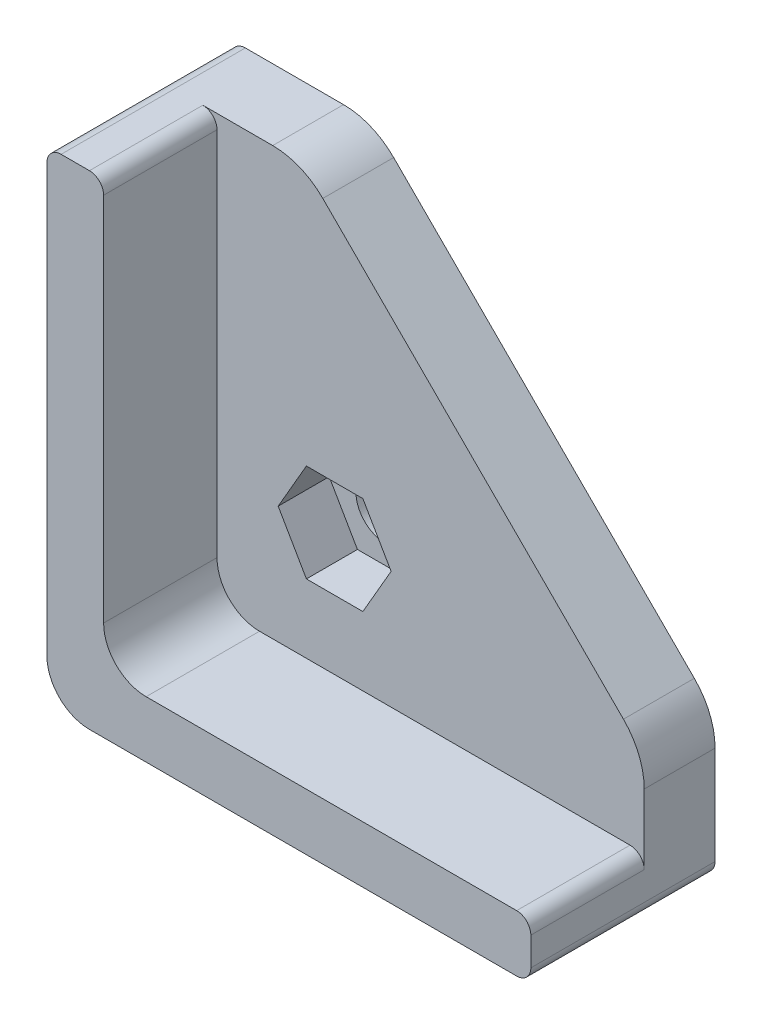
ISO-10303-21;
HEADER;
FILE_DESCRIPTION(('STEP AP214'),'2;1');
FILE_NAME('part.step','',(''),(''),'','','');
FILE_SCHEMA(('AUTOMOTIVE_DESIGN { 1 0 10303 214 1 1 1 1 }'));
ENDSEC;
DATA;
#1=APPLICATION_CONTEXT('core data for automotive mechanical design processes');
#2=APPLICATION_PROTOCOL_DEFINITION('international standard','automotive_design',2000,#1);
#3=PRODUCT_CONTEXT('',#1,'mechanical');
#4=PRODUCT('Part','Part','',(#3));
#5=PRODUCT_RELATED_PRODUCT_CATEGORY('part','',(#4));
#6=PRODUCT_DEFINITION_FORMATION('','',#4);
#7=PRODUCT_DEFINITION_CONTEXT('part definition',#1,'design');
#8=PRODUCT_DEFINITION('design','',#6,#7);
#9=PRODUCT_DEFINITION_SHAPE('','',#8);
#10=(LENGTH_UNIT() NAMED_UNIT(*) SI_UNIT(.MILLI.,.METRE.));
#11=(NAMED_UNIT(*) PLANE_ANGLE_UNIT() SI_UNIT($,.RADIAN.));
#12=(NAMED_UNIT(*) SI_UNIT($,.STERADIAN.) SOLID_ANGLE_UNIT());
#13=UNCERTAINTY_MEASURE_WITH_UNIT(LENGTH_MEASURE(1.E-05),#10,'distance_accuracy_value','');
#14=(GEOMETRIC_REPRESENTATION_CONTEXT(3) GLOBAL_UNCERTAINTY_ASSIGNED_CONTEXT((#13)) GLOBAL_UNIT_ASSIGNED_CONTEXT((#10,
#11,#12)) REPRESENTATION_CONTEXT('',''));
#15=CARTESIAN_POINT('',(0.,0.,0.));
#16=DIRECTION('',(0.,0.,1.));
#17=DIRECTION('',(1.,0.,0.));
#18=AXIS2_PLACEMENT_3D('',#15,#16,#17);
#19=CARTESIAN_POINT('',(235.585920771116,2.62277996633536,5.));
#20=DIRECTION('',(0.,0.,-1.));
#21=DIRECTION('',(-1.,0.,0.));
#22=AXIS2_PLACEMENT_3D('',#19,#20,#21);
#23=CYLINDRICAL_SURFACE('',#22,2.09999999999999);
#24=CARTESIAN_POINT('',(235.585920771116,2.62277996633536,0.));
#25=DIRECTION('',(0.,0.,1.));
#26=DIRECTION('',(1.,0.,0.));
#27=AXIS2_PLACEMENT_3D('',#24,#25,#26);
#28=CIRCLE('',#27,2.09999999999999);
#29=CARTESIAN_POINT('',(237.685920771116,2.62277996633536,0.));
#30=VERTEX_POINT('',#29);
#31=EDGE_CURVE('E259',#30,#30,#28,.T.);
#32=ORIENTED_EDGE('',*,*,#31,.F.);
#33=EDGE_LOOP('',(#32));
#34=FACE_BOUND('',#33,.T.);
#35=CARTESIAN_POINT('',(235.585920771116,2.62277996633536,1.4));
#36=DIRECTION('',(0.,0.,1.));
#37=DIRECTION('',(1.,0.,0.));
#38=AXIS2_PLACEMENT_3D('',#35,#36,#37);
#39=CIRCLE('',#38,2.09999999999999);
#40=CARTESIAN_POINT('',(237.685920771116,2.62277996633536,1.4));
#41=VERTEX_POINT('',#40);
#42=EDGE_CURVE('E234',#41,#41,#39,.T.);
#43=ORIENTED_EDGE('',*,*,#42,.T.);
#44=EDGE_LOOP('',(#43));
#45=FACE_BOUND('',#44,.T.);
#46=ADVANCED_FACE('F37',(#34,#45),#23,.F.);
#47=CARTESIAN_POINT('',(0.,0.,5.));
#48=DIRECTION('',(0.,0.,-1.));
#49=DIRECTION('',(-1.,0.,0.));
#50=AXIS2_PLACEMENT_3D('',#47,#48,#49);
#51=PLANE('',#50);
#52=DIRECTION('',(-0.500000000000004,0.866025403784436,0.));
#53=VECTOR('',#52,1.);
#54=CARTESIAN_POINT('',(239.569637628525,2.62277996633537,5.));
#55=LINE('',#54,#53);
#56=CARTESIAN_POINT('',(239.569637628525,2.62277996633536,5.));
#57=VERTEX_POINT('',#56);
#58=CARTESIAN_POINT('',(237.57777919982,6.07277996633536,5.));
#59=VERTEX_POINT('',#58);
#60=EDGE_CURVE('E222',#57,#59,#55,.T.);
#61=ORIENTED_EDGE('',*,*,#60,.F.);
#62=DIRECTION('',(0.499999999999997,0.866025403784441,0.));
#63=VECTOR('',#62,1.);
#64=CARTESIAN_POINT('',(237.57777919982,-0.827220033664637,5.));
#65=LINE('',#64,#63);
#66=CARTESIAN_POINT('',(237.57777919982,-0.827220033664637,5.));
#67=VERTEX_POINT('',#66);
#68=EDGE_CURVE('E190',#67,#57,#65,.T.);
#69=ORIENTED_EDGE('',*,*,#68,.F.);
#70=DIRECTION('',(1.,0.,0.));
#71=VECTOR('',#70,1.);
#72=CARTESIAN_POINT('',(233.594062342412,-0.827220033664661,5.));
#73=LINE('',#72,#71);
#74=CARTESIAN_POINT('',(233.594062342412,-0.827220033664661,5.));
#75=VERTEX_POINT('',#74);
#76=EDGE_CURVE('E208',#75,#67,#73,.T.);
#77=ORIENTED_EDGE('',*,*,#76,.F.);
#78=DIRECTION('',(0.500000000000005,-0.866025403784436,0.));
#79=VECTOR('',#78,1.);
#80=CARTESIAN_POINT('',(231.602203913708,2.62277996633537,5.));
#81=LINE('',#80,#79);
#82=CARTESIAN_POINT('',(231.602203913708,2.62277996633537,5.));
#83=VERTEX_POINT('',#82);
#84=EDGE_CURVE('E211',#83,#75,#81,.T.);
#85=ORIENTED_EDGE('',*,*,#84,.F.);
#86=DIRECTION('',(-0.499999999999996,-0.866025403784441,0.));
#87=VECTOR('',#86,1.);
#88=CARTESIAN_POINT('',(233.594062342412,6.07277996633534,5.));
#89=LINE('',#88,#87);
#90=CARTESIAN_POINT('',(233.594062342412,6.07277996633534,5.));
#91=VERTEX_POINT('',#90);
#92=EDGE_CURVE('E227',#91,#83,#89,.T.);
#93=ORIENTED_EDGE('',*,*,#92,.F.);
#94=DIRECTION('',(-1.,0.,0.));
#95=VECTOR('',#94,1.);
#96=CARTESIAN_POINT('',(237.57777919982,6.07277996633536,5.));
#97=LINE('',#96,#95);
#98=EDGE_CURVE('E224',#59,#91,#97,.T.);
#99=ORIENTED_EDGE('',*,*,#98,.F.);
#100=EDGE_LOOP('',(#61,#69,#77,#85,#93,#99));
#101=FACE_BOUND('',#100,.T.);
#102=DIRECTION('',(0.,1.,0.));
#103=VECTOR('',#102,1.);
#104=CARTESIAN_POINT('',(257.428056394845,0.322779966331834,5.));
#105=LINE('',#104,#103);
#106=CARTESIAN_POINT('',(257.428056394845,-6.67722003366817,5.));
#107=VERTEX_POINT('',#106);
#108=CARTESIAN_POINT('',(257.428056394845,-1.74828784553331,5.));
#109=VERTEX_POINT('',#108);
#110=EDGE_CURVE('E266',#107,#109,#105,.T.);
#111=ORIENTED_EDGE('',*,*,#110,.T.);
#112=CARTESIAN_POINT('',(252.428056394845,-1.74828784553331,5.));
#113=DIRECTION('',(0.,0.,-1.));
#114=DIRECTION('',(-1.,0.,0.));
#115=AXIS2_PLACEMENT_3D('',#112,#113,#114);
#116=CIRCLE('',#115,5.);
#117=CARTESIAN_POINT('',(255.963590300778,1.78724606039903,5.));
#118=VERTEX_POINT('',#117);
#119=EDGE_CURVE('E323',#109,#118,#116,.F.);
#120=ORIENTED_EDGE('',*,*,#119,.T.);
#121=DIRECTION('',(-0.707106781186468,0.707106781186627,0.));
#122=VECTOR('',#121,1.);
#123=CARTESIAN_POINT('',(233.285920771119,24.4649155900635,5.));
#124=LINE('',#123,#122);
#125=CARTESIAN_POINT('',(234.750386865186,23.0004494959958,5.));
#126=VERTEX_POINT('',#125);
#127=EDGE_CURVE('E269',#118,#126,#124,.T.);
#128=ORIENTED_EDGE('',*,*,#127,.T.);
#129=CARTESIAN_POINT('',(231.214852959253,19.4649155900635,5.));
#130=DIRECTION('',(0.,0.,-1.));
#131=DIRECTION('',(-1.,0.,0.));
#132=AXIS2_PLACEMENT_3D('',#129,#130,#131);
#133=CIRCLE('',#132,5.);
#134=CARTESIAN_POINT('',(231.214852959253,24.4649155900635,5.));
#135=VERTEX_POINT('',#134);
#136=EDGE_CURVE('E321',#126,#135,#133,.F.);
#137=ORIENTED_EDGE('',*,*,#136,.T.);
#138=DIRECTION('',(-1.,0.,0.));
#139=VECTOR('',#138,1.);
#140=CARTESIAN_POINT('',(223.285920771119,24.4649155900635,5.));
#141=LINE('',#140,#139);
#142=CARTESIAN_POINT('',(226.285920771119,24.4649155900635,5.));
#143=VERTEX_POINT('',#142);
#144=EDGE_CURVE('E55',#135,#143,#141,.T.);
#145=ORIENTED_EDGE('',*,*,#144,.T.);
#146=CARTESIAN_POINT('',(226.285920771119,23.4649155900635,5.));
#147=DIRECTION('',(0.,0.,-1.));
#148=DIRECTION('',(-1.,0.,0.));
#149=AXIS2_PLACEMENT_3D('',#146,#147,#148);
#150=CIRCLE('',#149,1.);
#151=CARTESIAN_POINT('',(227.285920771119,23.4649155900635,5.));
#152=VERTEX_POINT('',#151);
#153=EDGE_CURVE('E11',#143,#152,#150,.T.);
#154=ORIENTED_EDGE('',*,*,#153,.T.);
#155=DIRECTION('',(0.,1.,0.));
#156=VECTOR('',#155,1.);
#157=CARTESIAN_POINT('',(227.285920771119,24.4649155900635,5.));
#158=LINE('',#157,#156);
#159=CARTESIAN_POINT('',(227.285920771119,-2.67722003366816,5.));
#160=VERTEX_POINT('',#159);
#161=EDGE_CURVE('E246',#160,#152,#158,.T.);
#162=ORIENTED_EDGE('',*,*,#161,.F.);
#163=CARTESIAN_POINT('',(230.285920771119,-2.67722003366817,5.));
#164=DIRECTION('',(0.,0.,-1.));
#165=DIRECTION('',(-1.,0.,0.));
#166=AXIS2_PLACEMENT_3D('',#163,#164,#165);
#167=CIRCLE('',#166,3.);
#168=CARTESIAN_POINT('',(230.285920771119,-5.67722003366817,5.));
#169=VERTEX_POINT('',#168);
#170=EDGE_CURVE('E299',#160,#169,#167,.F.);
#171=ORIENTED_EDGE('',*,*,#170,.T.);
#172=DIRECTION('',(-1.,0.,0.));
#173=VECTOR('',#172,1.);
#174=CARTESIAN_POINT('',(227.285920771119,-5.67722003366817,5.));
#175=LINE('',#174,#173);
#176=CARTESIAN_POINT('',(256.428056394845,-5.67722003366817,5.));
#177=VERTEX_POINT('',#176);
#178=EDGE_CURVE('E260',#177,#169,#175,.T.);
#179=ORIENTED_EDGE('',*,*,#178,.F.);
#180=CARTESIAN_POINT('',(256.428056394845,-6.67722003366817,5.));
#181=DIRECTION('',(0.,0.,-1.));
#182=DIRECTION('',(-1.,0.,0.));
#183=AXIS2_PLACEMENT_3D('',#180,#181,#182);
#184=CIRCLE('',#183,1.);
#185=EDGE_CURVE('E45',#177,#107,#184,.T.);
#186=ORIENTED_EDGE('',*,*,#185,.T.);
#187=EDGE_LOOP('',(#111,#120,#128,#137,#145,#154,#162,#171,#179,#186));
#188=FACE_BOUND('',#187,.T.);
#189=ADVANCED_FACE('F362',(#101,#188),#51,.F.);
#190=CARTESIAN_POINT('',(0.,0.,0.));
#191=DIRECTION('',(0.,0.,-1.));
#192=DIRECTION('',(-1.,0.,0.));
#193=AXIS2_PLACEMENT_3D('',#190,#191,#192);
#194=PLANE('',#193);
#195=DIRECTION('',(0.,1.,0.));
#196=VECTOR('',#195,1.);
#197=CARTESIAN_POINT('',(257.428056394845,0.322779966331834,0.));
#198=LINE('',#197,#196);
#199=CARTESIAN_POINT('',(257.428056394845,-8.67722003366806,0.));
#200=VERTEX_POINT('',#199);
#201=CARTESIAN_POINT('',(257.428056394845,-1.74828784553331,0.));
#202=VERTEX_POINT('',#201);
#203=EDGE_CURVE('E265',#200,#202,#198,.T.);
#204=ORIENTED_EDGE('',*,*,#203,.F.);
#205=CARTESIAN_POINT('',(256.428056394845,-8.67722003366806,0.));
#206=DIRECTION('',(0.,0.,-1.));
#207=DIRECTION('',(-1.,0.,0.));
#208=AXIS2_PLACEMENT_3D('',#205,#206,#207);
#209=CIRCLE('',#208,1.);
#210=CARTESIAN_POINT('',(256.428056394845,-9.67722003366806,0.));
#211=VERTEX_POINT('',#210);
#212=EDGE_CURVE('E346',#200,#211,#209,.T.);
#213=ORIENTED_EDGE('',*,*,#212,.T.);
#214=DIRECTION('',(1.,-1.04056574490655E-13,0.));
#215=VECTOR('',#214,1.);
#216=CARTESIAN_POINT('',(257.428056394845,-9.67722003366817,0.));
#217=LINE('',#216,#215);
#218=CARTESIAN_POINT('',(226.285920771117,-9.67722003366493,0.));
#219=VERTEX_POINT('',#218);
#220=EDGE_CURVE('E270',#219,#211,#217,.T.);
#221=ORIENTED_EDGE('',*,*,#220,.F.);
#222=CARTESIAN_POINT('',(226.285920771117,-6.67722003366493,0.));
#223=DIRECTION('',(0.,0.,-1.));
#224=DIRECTION('',(-1.,0.,0.));
#225=AXIS2_PLACEMENT_3D('',#222,#223,#224);
#226=CIRCLE('',#225,3.);
#227=CARTESIAN_POINT('',(223.285920771117,-6.67722003366476,0.));
#228=VERTEX_POINT('',#227);
#229=EDGE_CURVE('E288',#219,#228,#226,.T.);
#230=ORIENTED_EDGE('',*,*,#229,.T.);
#231=DIRECTION('',(0.,-1.,0.));
#232=VECTOR('',#231,1.);
#233=CARTESIAN_POINT('',(223.285920771117,-9.67722003366461,0.));
#234=LINE('',#233,#232);
#235=CARTESIAN_POINT('',(223.285920771119,23.4649155900636,0.));
#236=VERTEX_POINT('',#235);
#237=EDGE_CURVE('E282',#236,#228,#234,.T.);
#238=ORIENTED_EDGE('',*,*,#237,.F.);
#239=CARTESIAN_POINT('',(224.285920771119,23.4649155900635,0.));
#240=DIRECTION('',(0.,0.,-1.));
#241=DIRECTION('',(-1.,0.,0.));
#242=AXIS2_PLACEMENT_3D('',#239,#240,#241);
#243=CIRCLE('',#242,1.);
#244=CARTESIAN_POINT('',(224.285920771119,24.4649155900635,0.));
#245=VERTEX_POINT('',#244);
#246=EDGE_CURVE('E344',#236,#245,#243,.T.);
#247=ORIENTED_EDGE('',*,*,#246,.T.);
#248=DIRECTION('',(-1.,0.,0.));
#249=VECTOR('',#248,1.);
#250=CARTESIAN_POINT('',(223.285920771119,24.4649155900635,0.));
#251=LINE('',#250,#249);
#252=CARTESIAN_POINT('',(231.214852959253,24.4649155900635,0.));
#253=VERTEX_POINT('',#252);
#254=EDGE_CURVE('E279',#253,#245,#251,.T.);
#255=ORIENTED_EDGE('',*,*,#254,.F.);
#256=CARTESIAN_POINT('',(231.214852959253,19.4649155900635,0.));
#257=DIRECTION('',(0.,0.,-1.));
#258=DIRECTION('',(-1.,0.,0.));
#259=AXIS2_PLACEMENT_3D('',#256,#257,#258);
#260=CIRCLE('',#259,5.);
#261=CARTESIAN_POINT('',(234.750386865186,23.0004494959958,0.));
#262=VERTEX_POINT('',#261);
#263=EDGE_CURVE('E314',#253,#262,#260,.T.);
#264=ORIENTED_EDGE('',*,*,#263,.T.);
#265=DIRECTION('',(-0.707106781186468,0.707106781186627,0.));
#266=VECTOR('',#265,1.);
#267=CARTESIAN_POINT('',(233.285920771119,24.4649155900635,0.));
#268=LINE('',#267,#266);
#269=CARTESIAN_POINT('',(255.963590300778,1.78724606039903,0.));
#270=VERTEX_POINT('',#269);
#271=EDGE_CURVE('E276',#270,#262,#268,.T.);
#272=ORIENTED_EDGE('',*,*,#271,.F.);
#273=CARTESIAN_POINT('',(252.428056394845,-1.74828784553331,0.));
#274=DIRECTION('',(0.,0.,-1.));
#275=DIRECTION('',(-1.,0.,0.));
#276=AXIS2_PLACEMENT_3D('',#273,#274,#275);
#277=CIRCLE('',#276,5.);
#278=EDGE_CURVE('E316',#270,#202,#277,.T.);
#279=ORIENTED_EDGE('',*,*,#278,.T.);
#280=EDGE_LOOP('',(#204,#213,#221,#230,#238,#247,#255,#264,#272,#279));
#281=FACE_BOUND('',#280,.T.);
#282=ORIENTED_EDGE('',*,*,#31,.T.);
#283=EDGE_LOOP('',(#282));
#284=FACE_BOUND('',#283,.T.);
#285=ADVANCED_FACE('F382',(#281,#284),#194,.T.);
#286=CARTESIAN_POINT('',(257.428056394845,0.322779966331834,5.));
#287=DIRECTION('',(-1.,0.,0.));
#288=DIRECTION('',(0.,0.,1.));
#289=AXIS2_PLACEMENT_3D('',#286,#287,#288);
#290=PLANE('',#289);
#291=ORIENTED_EDGE('',*,*,#110,.F.);
#292=DIRECTION('',(0.,0.,-1.));
#293=VECTOR('',#292,1.);
#294=CARTESIAN_POINT('',(257.428056394845,-6.67722003366817,5.));
#295=LINE('',#294,#293);
#296=CARTESIAN_POINT('',(257.428056394845,-6.67722003366817,13.));
#297=VERTEX_POINT('',#296);
#298=EDGE_CURVE('E334',#107,#297,#295,.F.);
#299=ORIENTED_EDGE('',*,*,#298,.T.);
#300=DIRECTION('',(0.,1.,0.));
#301=VECTOR('',#300,1.);
#302=CARTESIAN_POINT('',(257.428056394845,-5.67722003366817,13.));
#303=LINE('',#302,#301);
#304=CARTESIAN_POINT('',(257.428056394845,-8.67722003366806,13.));
#305=VERTEX_POINT('',#304);
#306=EDGE_CURVE('E242',#305,#297,#303,.T.);
#307=ORIENTED_EDGE('',*,*,#306,.F.);
#308=DIRECTION('',(0.,0.,-1.));
#309=VECTOR('',#308,1.);
#310=CARTESIAN_POINT('',(257.428056394845,-8.67722003366806,5.));
#311=LINE('',#310,#309);
#312=EDGE_CURVE('E331',#305,#200,#311,.T.);
#313=ORIENTED_EDGE('',*,*,#312,.T.);
#314=ORIENTED_EDGE('',*,*,#203,.T.);
#315=DIRECTION('',(0.,0.,-1.));
#316=VECTOR('',#315,1.);
#317=CARTESIAN_POINT('',(257.428056394845,-1.74828784553331,5.));
#318=LINE('',#317,#316);
#319=EDGE_CURVE('E319',#202,#109,#318,.F.);
#320=ORIENTED_EDGE('',*,*,#319,.T.);
#321=EDGE_LOOP('',(#291,#299,#307,#313,#314,#320));
#322=FACE_BOUND('',#321,.T.);
#323=ADVANCED_FACE('F370',(#322),#290,.F.);
#324=CARTESIAN_POINT('',(233.285920771119,24.4649155900635,5.));
#325=DIRECTION('',(-0.707106781186627,-0.707106781186468,0.));
#326=DIRECTION('',(0.707106781186468,-0.707106781186627,0.));
#327=AXIS2_PLACEMENT_3D('',#324,#325,#326);
#328=PLANE('',#327);
#329=ORIENTED_EDGE('',*,*,#127,.F.);
#330=DIRECTION('',(0.,0.,-1.));
#331=VECTOR('',#330,1.);
#332=CARTESIAN_POINT('',(255.963590300778,1.78724606039903,5.));
#333=LINE('',#332,#331);
#334=EDGE_CURVE('E311',#118,#270,#333,.T.);
#335=ORIENTED_EDGE('',*,*,#334,.T.);
#336=ORIENTED_EDGE('',*,*,#271,.T.);
#337=DIRECTION('',(0.,0.,-1.));
#338=VECTOR('',#337,1.);
#339=CARTESIAN_POINT('',(234.750386865186,23.0004494959958,5.));
#340=LINE('',#339,#338);
#341=EDGE_CURVE('E307',#262,#126,#340,.F.);
#342=ORIENTED_EDGE('',*,*,#341,.T.);
#343=EDGE_LOOP('',(#329,#335,#336,#342));
#344=FACE_BOUND('',#343,.T.);
#345=ADVANCED_FACE('F393',(#344),#328,.F.);
#346=CARTESIAN_POINT('',(223.285920771119,24.4649155900635,5.));
#347=DIRECTION('',(0.,-1.,0.));
#348=DIRECTION('',(0.,0.,-1.));
#349=AXIS2_PLACEMENT_3D('',#346,#347,#348);
#350=PLANE('',#349);
#351=ORIENTED_EDGE('',*,*,#254,.T.);
#352=DIRECTION('',(0.,0.,-1.));
#353=VECTOR('',#352,1.);
#354=CARTESIAN_POINT('',(224.285920771119,24.4649155900635,5.));
#355=LINE('',#354,#353);
#356=CARTESIAN_POINT('',(224.285920771119,24.4649155900635,13.));
#357=VERTEX_POINT('',#356);
#358=EDGE_CURVE('E356',#245,#357,#355,.F.);
#359=ORIENTED_EDGE('',*,*,#358,.T.);
#360=DIRECTION('',(-1.,0.,0.));
#361=VECTOR('',#360,1.);
#362=CARTESIAN_POINT('',(223.285920771119,24.4649155900635,13.));
#363=LINE('',#362,#361);
#364=CARTESIAN_POINT('',(226.285920771119,24.4649155900635,13.));
#365=VERTEX_POINT('',#364);
#366=EDGE_CURVE('E251',#365,#357,#363,.T.);
#367=ORIENTED_EDGE('',*,*,#366,.F.);
#368=DIRECTION('',(0.,0.,-1.));
#369=VECTOR('',#368,1.);
#370=CARTESIAN_POINT('',(226.285920771119,24.4649155900635,5.));
#371=LINE('',#370,#369);
#372=EDGE_CURVE('E353',#365,#143,#371,.T.);
#373=ORIENTED_EDGE('',*,*,#372,.T.);
#374=ORIENTED_EDGE('',*,*,#144,.F.);
#375=DIRECTION('',(0.,0.,-1.));
#376=VECTOR('',#375,1.);
#377=CARTESIAN_POINT('',(231.214852959253,24.4649155900635,5.));
#378=LINE('',#377,#376);
#379=EDGE_CURVE('E325',#135,#253,#378,.T.);
#380=ORIENTED_EDGE('',*,*,#379,.T.);
#381=EDGE_LOOP('',(#351,#359,#367,#373,#374,#380));
#382=FACE_BOUND('',#381,.T.);
#383=ADVANCED_FACE('F399',(#382),#350,.F.);
#384=CARTESIAN_POINT('',(223.285920771117,-9.67722003366461,5.));
#385=DIRECTION('',(1.,0.,0.));
#386=DIRECTION('',(0.,1.,0.));
#387=AXIS2_PLACEMENT_3D('',#384,#385,#386);
#388=PLANE('',#387);
#389=DIRECTION('',(0.,-1.,0.));
#390=VECTOR('',#389,1.);
#391=CARTESIAN_POINT('',(223.285920771117,-9.67722003366461,13.));
#392=LINE('',#391,#390);
#393=CARTESIAN_POINT('',(223.285920771119,23.4649155900636,13.));
#394=VERTEX_POINT('',#393);
#395=CARTESIAN_POINT('',(223.285920771117,-6.67722003366476,13.));
#396=VERTEX_POINT('',#395);
#397=EDGE_CURVE('E254',#394,#396,#392,.T.);
#398=ORIENTED_EDGE('',*,*,#397,.F.);
#399=DIRECTION('',(0.,0.,-1.));
#400=VECTOR('',#399,1.);
#401=CARTESIAN_POINT('',(223.285920771119,23.4649155900636,5.));
#402=LINE('',#401,#400);
#403=EDGE_CURVE('E350',#394,#236,#402,.T.);
#404=ORIENTED_EDGE('',*,*,#403,.T.);
#405=ORIENTED_EDGE('',*,*,#237,.T.);
#406=DIRECTION('',(0.,0.,-1.));
#407=VECTOR('',#406,1.);
#408=CARTESIAN_POINT('',(223.285920771117,-6.67722003366476,5.));
#409=LINE('',#408,#407);
#410=EDGE_CURVE('E291',#228,#396,#409,.F.);
#411=ORIENTED_EDGE('',*,*,#410,.T.);
#412=EDGE_LOOP('',(#398,#404,#405,#411));
#413=FACE_BOUND('',#412,.T.);
#414=ADVANCED_FACE('F424',(#413),#388,.F.);
#415=CARTESIAN_POINT('',(257.428056394845,-9.67722003366817,5.));
#416=DIRECTION('',(1.04056574490655E-13,1.,0.));
#417=DIRECTION('',(-1.,1.04056574490655E-13,0.));
#418=AXIS2_PLACEMENT_3D('',#415,#416,#417);
#419=PLANE('',#418);
#420=ORIENTED_EDGE('',*,*,#220,.T.);
#421=DIRECTION('',(0.,0.,-1.));
#422=VECTOR('',#421,1.);
#423=CARTESIAN_POINT('',(256.428056394845,-9.67722003366806,5.));
#424=LINE('',#423,#422);
#425=CARTESIAN_POINT('',(256.428056394845,-9.67722003366806,13.));
#426=VERTEX_POINT('',#425);
#427=EDGE_CURVE('E348',#211,#426,#424,.F.);
#428=ORIENTED_EDGE('',*,*,#427,.T.);
#429=DIRECTION('',(1.,-1.04056574490655E-13,0.));
#430=VECTOR('',#429,1.);
#431=CARTESIAN_POINT('',(257.428056394845,-9.67722003366817,13.));
#432=LINE('',#431,#430);
#433=CARTESIAN_POINT('',(226.285920771117,-9.67722003366493,13.));
#434=VERTEX_POINT('',#433);
#435=EDGE_CURVE('E256',#434,#426,#432,.T.);
#436=ORIENTED_EDGE('',*,*,#435,.F.);
#437=DIRECTION('',(0.,0.,-1.));
#438=VECTOR('',#437,1.);
#439=CARTESIAN_POINT('',(226.285920771117,-9.67722003366493,5.));
#440=LINE('',#439,#438);
#441=EDGE_CURVE('E274',#434,#219,#440,.T.);
#442=ORIENTED_EDGE('',*,*,#441,.T.);
#443=EDGE_LOOP('',(#420,#428,#436,#442));
#444=FACE_BOUND('',#443,.T.);
#445=ADVANCED_FACE('F417',(#444),#419,.F.);
#446=CARTESIAN_POINT('',(227.285920771119,-5.67722003366817,13.));
#447=DIRECTION('',(0.,-1.,0.));
#448=DIRECTION('',(0.,0.,-1.));
#449=AXIS2_PLACEMENT_3D('',#446,#447,#448);
#450=PLANE('',#449);
#451=DIRECTION('',(-1.,0.,0.));
#452=VECTOR('',#451,1.);
#453=CARTESIAN_POINT('',(227.285920771119,-5.67722003366817,13.));
#454=LINE('',#453,#452);
#455=CARTESIAN_POINT('',(256.428056394845,-5.67722003366817,13.));
#456=VERTEX_POINT('',#455);
#457=CARTESIAN_POINT('',(230.285920771119,-5.67722003366817,13.));
#458=VERTEX_POINT('',#457);
#459=EDGE_CURVE('E245',#456,#458,#454,.T.);
#460=ORIENTED_EDGE('',*,*,#459,.F.);
#461=DIRECTION('',(0.,0.,-1.));
#462=VECTOR('',#461,1.);
#463=CARTESIAN_POINT('',(256.428056394845,-5.67722003366817,13.));
#464=LINE('',#463,#462);
#465=EDGE_CURVE('E328',#456,#177,#464,.T.);
#466=ORIENTED_EDGE('',*,*,#465,.T.);
#467=ORIENTED_EDGE('',*,*,#178,.T.);
#468=DIRECTION('',(0.,0.,-1.));
#469=VECTOR('',#468,1.);
#470=CARTESIAN_POINT('',(230.285920771119,-5.67722003366817,13.));
#471=LINE('',#470,#469);
#472=EDGE_CURVE('E302',#169,#458,#471,.F.);
#473=ORIENTED_EDGE('',*,*,#472,.T.);
#474=EDGE_LOOP('',(#460,#466,#467,#473));
#475=FACE_BOUND('',#474,.T.);
#476=ADVANCED_FACE('F415',(#475),#450,.F.);
#477=CARTESIAN_POINT('',(227.285920771119,24.4649155900635,13.));
#478=DIRECTION('',(-1.,0.,0.));
#479=DIRECTION('',(0.,0.,1.));
#480=AXIS2_PLACEMENT_3D('',#477,#478,#479);
#481=PLANE('',#480);
#482=ORIENTED_EDGE('',*,*,#161,.T.);
#483=DIRECTION('',(0.,0.,-1.));
#484=VECTOR('',#483,1.);
#485=CARTESIAN_POINT('',(227.285920771119,23.4649155900635,13.));
#486=LINE('',#485,#484);
#487=CARTESIAN_POINT('',(227.285920771119,23.4649155900635,13.));
#488=VERTEX_POINT('',#487);
#489=EDGE_CURVE('E358',#152,#488,#486,.F.);
#490=ORIENTED_EDGE('',*,*,#489,.T.);
#491=DIRECTION('',(0.,1.,0.));
#492=VECTOR('',#491,1.);
#493=CARTESIAN_POINT('',(227.285920771119,24.4649155900635,13.));
#494=LINE('',#493,#492);
#495=CARTESIAN_POINT('',(227.285920771119,-2.67722003366816,13.));
#496=VERTEX_POINT('',#495);
#497=EDGE_CURVE('E248',#496,#488,#494,.T.);
#498=ORIENTED_EDGE('',*,*,#497,.F.);
#499=DIRECTION('',(0.,0.,-1.));
#500=VECTOR('',#499,1.);
#501=CARTESIAN_POINT('',(227.285920771119,-2.67722003366817,5.));
#502=LINE('',#501,#500);
#503=EDGE_CURVE('E296',#496,#160,#502,.T.);
#504=ORIENTED_EDGE('',*,*,#503,.T.);
#505=EDGE_LOOP('',(#482,#490,#498,#504));
#506=FACE_BOUND('',#505,.T.);
#507=ADVANCED_FACE('F408',(#506),#481,.F.);
#508=CARTESIAN_POINT('',(0.,0.,13.));
#509=DIRECTION('',(0.,0.,-1.));
#510=DIRECTION('',(-1.,0.,0.));
#511=AXIS2_PLACEMENT_3D('',#508,#509,#510);
#512=PLANE('',#511);
#513=ORIENTED_EDGE('',*,*,#306,.T.);
#514=CARTESIAN_POINT('',(256.428056394845,-6.67722003366817,13.));
#515=DIRECTION('',(0.,0.,-1.));
#516=DIRECTION('',(-1.,0.,0.));
#517=AXIS2_PLACEMENT_3D('',#514,#515,#516);
#518=CIRCLE('',#517,1.);
#519=EDGE_CURVE('E342',#297,#456,#518,.F.);
#520=ORIENTED_EDGE('',*,*,#519,.T.);
#521=ORIENTED_EDGE('',*,*,#459,.T.);
#522=CARTESIAN_POINT('',(230.285920771119,-2.67722003366817,13.));
#523=DIRECTION('',(0.,0.,-1.));
#524=DIRECTION('',(-1.,0.,0.));
#525=AXIS2_PLACEMENT_3D('',#522,#523,#524);
#526=CIRCLE('',#525,3.);
#527=EDGE_CURVE('E305',#458,#496,#526,.T.);
#528=ORIENTED_EDGE('',*,*,#527,.T.);
#529=ORIENTED_EDGE('',*,*,#497,.T.);
#530=CARTESIAN_POINT('',(226.285920771119,23.4649155900635,13.));
#531=DIRECTION('',(0.,0.,-1.));
#532=DIRECTION('',(-1.,0.,0.));
#533=AXIS2_PLACEMENT_3D('',#530,#531,#532);
#534=CIRCLE('',#533,1.);
#535=EDGE_CURVE('E336',#488,#365,#534,.F.);
#536=ORIENTED_EDGE('',*,*,#535,.T.);
#537=ORIENTED_EDGE('',*,*,#366,.T.);
#538=CARTESIAN_POINT('',(224.285920771119,23.4649155900635,13.));
#539=DIRECTION('',(0.,0.,-1.));
#540=DIRECTION('',(-1.,0.,0.));
#541=AXIS2_PLACEMENT_3D('',#538,#539,#540);
#542=CIRCLE('',#541,1.);
#543=EDGE_CURVE('E338',#357,#394,#542,.F.);
#544=ORIENTED_EDGE('',*,*,#543,.T.);
#545=ORIENTED_EDGE('',*,*,#397,.T.);
#546=CARTESIAN_POINT('',(226.285920771117,-6.67722003366493,13.));
#547=DIRECTION('',(0.,0.,-1.));
#548=DIRECTION('',(-1.,0.,0.));
#549=AXIS2_PLACEMENT_3D('',#546,#547,#548);
#550=CIRCLE('',#549,3.);
#551=EDGE_CURVE('E294',#396,#434,#550,.F.);
#552=ORIENTED_EDGE('',*,*,#551,.T.);
#553=ORIENTED_EDGE('',*,*,#435,.T.);
#554=CARTESIAN_POINT('',(256.428056394845,-8.67722003366806,13.));
#555=DIRECTION('',(0.,0.,-1.));
#556=DIRECTION('',(-1.,0.,0.));
#557=AXIS2_PLACEMENT_3D('',#554,#555,#556);
#558=CIRCLE('',#557,1.);
#559=EDGE_CURVE('E340',#426,#305,#558,.F.);
#560=ORIENTED_EDGE('',*,*,#559,.T.);
#561=EDGE_LOOP('',(#513,#520,#521,#528,#529,#536,#537,#544,#545,#552,#553,#560));
#562=FACE_BOUND('',#561,.T.);
#563=ADVANCED_FACE('F373',(#562),#512,.F.);
#564=CARTESIAN_POINT('',(226.285920771117,-6.67722003366493,5.));
#565=DIRECTION('',(0.,0.,-1.));
#566=DIRECTION('',(-1.,0.,0.));
#567=AXIS2_PLACEMENT_3D('',#564,#565,#566);
#568=CYLINDRICAL_SURFACE('',#567,3.);
#569=ORIENTED_EDGE('',*,*,#551,.F.);
#570=ORIENTED_EDGE('',*,*,#410,.F.);
#571=ORIENTED_EDGE('',*,*,#229,.F.);
#572=ORIENTED_EDGE('',*,*,#441,.F.);
#573=EDGE_LOOP('',(#569,#570,#571,#572));
#574=FACE_BOUND('',#573,.T.);
#575=ADVANCED_FACE('F449',(#574),#568,.T.);
#576=CARTESIAN_POINT('',(230.285920771119,-2.67722003366817,13.));
#577=DIRECTION('',(0.,0.,1.));
#578=DIRECTION('',(1.,0.,0.));
#579=AXIS2_PLACEMENT_3D('',#576,#577,#578);
#580=CYLINDRICAL_SURFACE('',#579,3.);
#581=ORIENTED_EDGE('',*,*,#527,.F.);
#582=ORIENTED_EDGE('',*,*,#472,.F.);
#583=ORIENTED_EDGE('',*,*,#170,.F.);
#584=ORIENTED_EDGE('',*,*,#503,.F.);
#585=EDGE_LOOP('',(#581,#582,#583,#584));
#586=FACE_BOUND('',#585,.T.);
#587=ADVANCED_FACE('F413',(#586),#580,.F.);
#588=CARTESIAN_POINT('',(237.57777919982,-0.827220033664637,1.4));
#589=DIRECTION('',(0.86602540378444,-0.499999999999997,0.));
#590=DIRECTION('',(0.499999999999997,0.86602540378444,0.));
#591=AXIS2_PLACEMENT_3D('',#588,#589,#590);
#592=PLANE('',#591);
#593=ORIENTED_EDGE('',*,*,#68,.T.);
#594=DIRECTION('',(0.,0.,1.));
#595=VECTOR('',#594,1.);
#596=CARTESIAN_POINT('',(239.569637628525,2.62277996633537,1.4));
#597=LINE('',#596,#595);
#598=CARTESIAN_POINT('',(239.569637628525,2.62277996633537,1.4));
#599=VERTEX_POINT('',#598);
#600=EDGE_CURVE('E183',#599,#57,#597,.T.);
#601=ORIENTED_EDGE('',*,*,#600,.F.);
#602=DIRECTION('',(0.499999999999997,0.866025403784441,0.));
#603=VECTOR('',#602,1.);
#604=CARTESIAN_POINT('',(237.57777919982,-0.827220033664637,1.4));
#605=LINE('',#604,#603);
#606=CARTESIAN_POINT('',(237.57777919982,-0.827220033664637,1.4));
#607=VERTEX_POINT('',#606);
#608=EDGE_CURVE('E187',#607,#599,#605,.T.);
#609=ORIENTED_EDGE('',*,*,#608,.F.);
#610=DIRECTION('',(0.,0.,1.));
#611=VECTOR('',#610,1.);
#612=CARTESIAN_POINT('',(237.57777919982,-0.827220033664637,1.4));
#613=LINE('',#612,#611);
#614=EDGE_CURVE('E232',#607,#67,#613,.T.);
#615=ORIENTED_EDGE('',*,*,#614,.T.);
#616=EDGE_LOOP('',(#593,#601,#609,#615));
#617=FACE_BOUND('',#616,.T.);
#618=ADVANCED_FACE('F185',(#617),#592,.F.);
#619=CARTESIAN_POINT('',(233.594062342412,-0.827220033664661,1.4));
#620=DIRECTION('',(0.,-1.,0.));
#621=DIRECTION('',(1.,0.,0.));
#622=AXIS2_PLACEMENT_3D('',#619,#620,#621);
#623=PLANE('',#622);
#624=ORIENTED_EDGE('',*,*,#76,.T.);
#625=ORIENTED_EDGE('',*,*,#614,.F.);
#626=DIRECTION('',(1.,0.,0.));
#627=VECTOR('',#626,1.);
#628=CARTESIAN_POINT('',(233.594062342412,-0.827220033664661,1.4));
#629=LINE('',#628,#627);
#630=CARTESIAN_POINT('',(233.594062342412,-0.827220033664661,1.4));
#631=VERTEX_POINT('',#630);
#632=EDGE_CURVE('E195',#631,#607,#629,.T.);
#633=ORIENTED_EDGE('',*,*,#632,.F.);
#634=DIRECTION('',(0.,0.,1.));
#635=VECTOR('',#634,1.);
#636=CARTESIAN_POINT('',(233.594062342412,-0.827220033664661,1.4));
#637=LINE('',#636,#635);
#638=EDGE_CURVE('E235',#631,#75,#637,.T.);
#639=ORIENTED_EDGE('',*,*,#638,.T.);
#640=EDGE_LOOP('',(#624,#625,#633,#639));
#641=FACE_BOUND('',#640,.T.);
#642=ADVANCED_FACE('F634',(#641),#623,.F.);
#643=CARTESIAN_POINT('',(231.602203913708,2.62277996633537,1.4));
#644=DIRECTION('',(-0.866025403784436,-0.500000000000005,0.));
#645=DIRECTION('',(0.500000000000005,-0.866025403784436,0.));
#646=AXIS2_PLACEMENT_3D('',#643,#644,#645);
#647=PLANE('',#646);
#648=ORIENTED_EDGE('',*,*,#84,.T.);
#649=ORIENTED_EDGE('',*,*,#638,.F.);
#650=DIRECTION('',(0.500000000000005,-0.866025403784436,0.));
#651=VECTOR('',#650,1.);
#652=CARTESIAN_POINT('',(231.602203913708,2.62277996633537,1.4));
#653=LINE('',#652,#651);
#654=CARTESIAN_POINT('',(231.602203913708,2.62277996633537,1.4));
#655=VERTEX_POINT('',#654);
#656=EDGE_CURVE('E218',#655,#631,#653,.T.);
#657=ORIENTED_EDGE('',*,*,#656,.F.);
#658=DIRECTION('',(0.,0.,1.));
#659=VECTOR('',#658,1.);
#660=CARTESIAN_POINT('',(231.602203913708,2.62277996633537,1.4));
#661=LINE('',#660,#659);
#662=EDGE_CURVE('E237',#655,#83,#661,.T.);
#663=ORIENTED_EDGE('',*,*,#662,.T.);
#664=EDGE_LOOP('',(#648,#649,#657,#663));
#665=FACE_BOUND('',#664,.T.);
#666=ADVANCED_FACE('F623',(#665),#647,.F.);
#667=CARTESIAN_POINT('',(233.594062342412,6.07277996633534,1.4));
#668=DIRECTION('',(-0.866025403784441,0.499999999999996,0.));
#669=DIRECTION('',(-0.499999999999996,-0.866025403784441,0.));
#670=AXIS2_PLACEMENT_3D('',#667,#668,#669);
#671=PLANE('',#670);
#672=ORIENTED_EDGE('',*,*,#92,.T.);
#673=ORIENTED_EDGE('',*,*,#662,.F.);
#674=DIRECTION('',(-0.499999999999996,-0.866025403784441,0.));
#675=VECTOR('',#674,1.);
#676=CARTESIAN_POINT('',(233.594062342412,6.07277996633534,1.4));
#677=LINE('',#676,#675);
#678=CARTESIAN_POINT('',(233.594062342412,6.07277996633534,1.4));
#679=VERTEX_POINT('',#678);
#680=EDGE_CURVE('E215',#679,#655,#677,.T.);
#681=ORIENTED_EDGE('',*,*,#680,.F.);
#682=DIRECTION('',(0.,0.,1.));
#683=VECTOR('',#682,1.);
#684=CARTESIAN_POINT('',(233.594062342412,6.07277996633534,1.4));
#685=LINE('',#684,#683);
#686=EDGE_CURVE('E239',#679,#91,#685,.T.);
#687=ORIENTED_EDGE('',*,*,#686,.T.);
#688=EDGE_LOOP('',(#672,#673,#681,#687));
#689=FACE_BOUND('',#688,.T.);
#690=ADVANCED_FACE('F612',(#689),#671,.F.);
#691=CARTESIAN_POINT('',(237.57777919982,6.07277996633536,1.4));
#692=DIRECTION('',(0.,1.,0.));
#693=DIRECTION('',(-1.,0.,0.));
#694=AXIS2_PLACEMENT_3D('',#691,#692,#693);
#695=PLANE('',#694);
#696=ORIENTED_EDGE('',*,*,#98,.T.);
#697=ORIENTED_EDGE('',*,*,#686,.F.);
#698=DIRECTION('',(-1.,0.,0.));
#699=VECTOR('',#698,1.);
#700=CARTESIAN_POINT('',(237.57777919982,6.07277996633536,1.4));
#701=LINE('',#700,#699);
#702=CARTESIAN_POINT('',(237.57777919982,6.07277996633536,1.4));
#703=VERTEX_POINT('',#702);
#704=EDGE_CURVE('E203',#703,#679,#701,.T.);
#705=ORIENTED_EDGE('',*,*,#704,.F.);
#706=DIRECTION('',(0.,0.,1.));
#707=VECTOR('',#706,1.);
#708=CARTESIAN_POINT('',(237.57777919982,6.07277996633536,1.4));
#709=LINE('',#708,#707);
#710=EDGE_CURVE('E194',#703,#59,#709,.T.);
#711=ORIENTED_EDGE('',*,*,#710,.T.);
#712=EDGE_LOOP('',(#696,#697,#705,#711));
#713=FACE_BOUND('',#712,.T.);
#714=ADVANCED_FACE('F602',(#713),#695,.F.);
#715=CARTESIAN_POINT('',(239.569637628525,2.62277996633537,1.4));
#716=DIRECTION('',(0.866025403784436,0.500000000000004,0.));
#717=DIRECTION('',(-0.500000000000004,0.866025403784436,0.));
#718=AXIS2_PLACEMENT_3D('',#715,#716,#717);
#719=PLANE('',#718);
#720=ORIENTED_EDGE('',*,*,#60,.T.);
#721=ORIENTED_EDGE('',*,*,#710,.F.);
#722=DIRECTION('',(-0.500000000000004,0.866025403784436,0.));
#723=VECTOR('',#722,1.);
#724=CARTESIAN_POINT('',(239.569637628525,2.62277996633537,1.4));
#725=LINE('',#724,#723);
#726=EDGE_CURVE('E198',#599,#703,#725,.T.);
#727=ORIENTED_EDGE('',*,*,#726,.F.);
#728=ORIENTED_EDGE('',*,*,#600,.T.);
#729=EDGE_LOOP('',(#720,#721,#727,#728));
#730=FACE_BOUND('',#729,.T.);
#731=ADVANCED_FACE('F199',(#730),#719,.F.);
#732=CARTESIAN_POINT('',(0.,0.,1.4));
#733=DIRECTION('',(0.,0.,1.));
#734=DIRECTION('',(1.,0.,0.));
#735=AXIS2_PLACEMENT_3D('',#732,#733,#734);
#736=PLANE('',#735);
#737=ORIENTED_EDGE('',*,*,#42,.F.);
#738=EDGE_LOOP('',(#737));
#739=FACE_BOUND('',#738,.T.);
#740=ORIENTED_EDGE('',*,*,#608,.T.);
#741=ORIENTED_EDGE('',*,*,#726,.T.);
#742=ORIENTED_EDGE('',*,*,#704,.T.);
#743=ORIENTED_EDGE('',*,*,#680,.T.);
#744=ORIENTED_EDGE('',*,*,#656,.T.);
#745=ORIENTED_EDGE('',*,*,#632,.T.);
#746=EDGE_LOOP('',(#740,#741,#742,#743,#744,#745));
#747=FACE_BOUND('',#746,.T.);
#748=ADVANCED_FACE('F205',(#739,#747),#736,.T.);
#749=CARTESIAN_POINT('',(252.428056394845,-1.74828784553331,5.));
#750=DIRECTION('',(0.,0.,-1.));
#751=DIRECTION('',(-1.,0.,0.));
#752=AXIS2_PLACEMENT_3D('',#749,#750,#751);
#753=CYLINDRICAL_SURFACE('',#752,5.);
#754=ORIENTED_EDGE('',*,*,#119,.F.);
#755=ORIENTED_EDGE('',*,*,#319,.F.);
#756=ORIENTED_EDGE('',*,*,#278,.F.);
#757=ORIENTED_EDGE('',*,*,#334,.F.);
#758=EDGE_LOOP('',(#754,#755,#756,#757));
#759=FACE_BOUND('',#758,.T.);
#760=ADVANCED_FACE('F389',(#759),#753,.T.);
#761=CARTESIAN_POINT('',(231.214852959253,19.4649155900635,5.));
#762=DIRECTION('',(0.,0.,-1.));
#763=DIRECTION('',(-1.,0.,0.));
#764=AXIS2_PLACEMENT_3D('',#761,#762,#763);
#765=CYLINDRICAL_SURFACE('',#764,5.);
#766=ORIENTED_EDGE('',*,*,#136,.F.);
#767=ORIENTED_EDGE('',*,*,#341,.F.);
#768=ORIENTED_EDGE('',*,*,#263,.F.);
#769=ORIENTED_EDGE('',*,*,#379,.F.);
#770=EDGE_LOOP('',(#766,#767,#768,#769));
#771=FACE_BOUND('',#770,.T.);
#772=ADVANCED_FACE('F396',(#771),#765,.T.);
#773=CARTESIAN_POINT('',(256.428056394845,-6.67722003366817,13.));
#774=DIRECTION('',(0.,0.,-1.));
#775=DIRECTION('',(-1.,0.,0.));
#776=AXIS2_PLACEMENT_3D('',#773,#774,#775);
#777=CYLINDRICAL_SURFACE('',#776,1.);
#778=ORIENTED_EDGE('',*,*,#519,.F.);
#779=ORIENTED_EDGE('',*,*,#298,.F.);
#780=ORIENTED_EDGE('',*,*,#185,.F.);
#781=ORIENTED_EDGE('',*,*,#465,.F.);
#782=EDGE_LOOP('',(#778,#779,#780,#781));
#783=FACE_BOUND('',#782,.T.);
#784=ADVANCED_FACE('F367',(#783),#777,.T.);
#785=CARTESIAN_POINT('',(256.428056394845,-8.67722003366806,5.));
#786=DIRECTION('',(0.,0.,-1.));
#787=DIRECTION('',(-1.,0.,0.));
#788=AXIS2_PLACEMENT_3D('',#785,#786,#787);
#789=CYLINDRICAL_SURFACE('',#788,1.);
#790=ORIENTED_EDGE('',*,*,#559,.F.);
#791=ORIENTED_EDGE('',*,*,#427,.F.);
#792=ORIENTED_EDGE('',*,*,#212,.F.);
#793=ORIENTED_EDGE('',*,*,#312,.F.);
#794=EDGE_LOOP('',(#790,#791,#792,#793));
#795=FACE_BOUND('',#794,.T.);
#796=ADVANCED_FACE('F379',(#795),#789,.T.);
#797=CARTESIAN_POINT('',(224.285920771119,23.4649155900635,5.));
#798=DIRECTION('',(0.,0.,-1.));
#799=DIRECTION('',(-1.,0.,0.));
#800=AXIS2_PLACEMENT_3D('',#797,#798,#799);
#801=CYLINDRICAL_SURFACE('',#800,1.);
#802=ORIENTED_EDGE('',*,*,#543,.F.);
#803=ORIENTED_EDGE('',*,*,#358,.F.);
#804=ORIENTED_EDGE('',*,*,#246,.F.);
#805=ORIENTED_EDGE('',*,*,#403,.F.);
#806=EDGE_LOOP('',(#802,#803,#804,#805));
#807=FACE_BOUND('',#806,.T.);
#808=ADVANCED_FACE('F462',(#807),#801,.T.);
#809=CARTESIAN_POINT('',(226.285920771119,23.4649155900635,5.));
#810=DIRECTION('',(0.,0.,-1.));
#811=DIRECTION('',(-1.,0.,0.));
#812=AXIS2_PLACEMENT_3D('',#809,#810,#811);
#813=CYLINDRICAL_SURFACE('',#812,1.);
#814=ORIENTED_EDGE('',*,*,#535,.F.);
#815=ORIENTED_EDGE('',*,*,#489,.F.);
#816=ORIENTED_EDGE('',*,*,#153,.F.);
#817=ORIENTED_EDGE('',*,*,#372,.F.);
#818=EDGE_LOOP('',(#814,#815,#816,#817));
#819=FACE_BOUND('',#818,.T.);
#820=ADVANCED_FACE('F39',(#819),#813,.T.);
#821=CLOSED_SHELL('',(#46,#189,#285,#323,#345,#383,#414,#445,#476,#507,#563,#575,#587,#618,#642,
#666,#690,#714,#731,#748,#760,#772,#784,#796,#808,#820));
#822=MANIFOLD_SOLID_BREP('B2',#821);
#823=ADVANCED_BREP_SHAPE_REPRESENTATION('',(#18,#822),#14);
#824=SHAPE_DEFINITION_REPRESENTATION(#9,#823);
ENDSEC;
END-ISO-10303-21;
